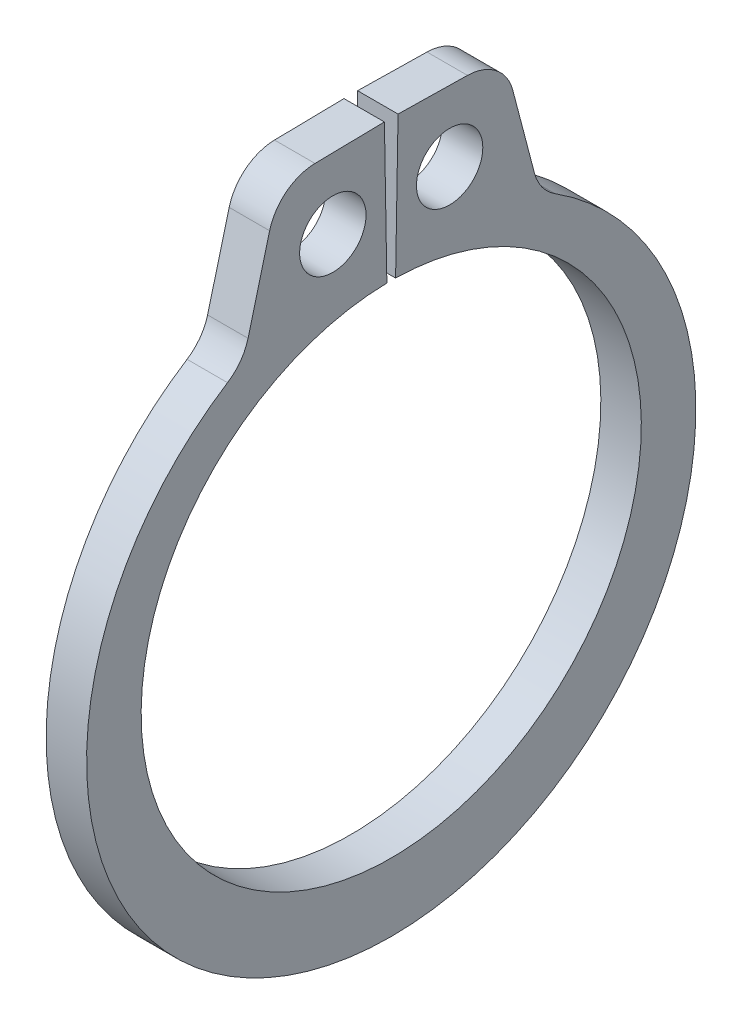
ISO-10303-21;
HEADER;
FILE_DESCRIPTION(('STEP AP214'),'2;1');
FILE_NAME('part.step','',(''),(''),'','','');
FILE_SCHEMA(('AUTOMOTIVE_DESIGN { 1 0 10303 214 1 1 1 1 }'));
ENDSEC;
DATA;
#1=APPLICATION_CONTEXT('core data for automotive mechanical design processes');
#2=APPLICATION_PROTOCOL_DEFINITION('international standard','automotive_design',2000,#1);
#3=PRODUCT_CONTEXT('',#1,'mechanical');
#4=PRODUCT('Part','Part','',(#3));
#5=PRODUCT_RELATED_PRODUCT_CATEGORY('part','',(#4));
#6=PRODUCT_DEFINITION_FORMATION('','',#4);
#7=PRODUCT_DEFINITION_CONTEXT('part definition',#1,'design');
#8=PRODUCT_DEFINITION('design','',#6,#7);
#9=PRODUCT_DEFINITION_SHAPE('','',#8);
#10=(LENGTH_UNIT() NAMED_UNIT(*) SI_UNIT(.MILLI.,.METRE.));
#11=(NAMED_UNIT(*) PLANE_ANGLE_UNIT() SI_UNIT($,.RADIAN.));
#12=(NAMED_UNIT(*) SI_UNIT($,.STERADIAN.) SOLID_ANGLE_UNIT());
#13=UNCERTAINTY_MEASURE_WITH_UNIT(LENGTH_MEASURE(1.E-05),#10,'distance_accuracy_value','');
#14=(GEOMETRIC_REPRESENTATION_CONTEXT(3) GLOBAL_UNCERTAINTY_ASSIGNED_CONTEXT((#13)) GLOBAL_UNIT_ASSIGNED_CONTEXT((#10,
#11,#12)) REPRESENTATION_CONTEXT('',''));
#15=CARTESIAN_POINT('',(0.,0.,0.));
#16=DIRECTION('',(0.,0.,1.));
#17=DIRECTION('',(1.,0.,0.));
#18=AXIS2_PLACEMENT_3D('',#15,#16,#17);
#19=CARTESIAN_POINT('',(0.3175,0.,0.));
#20=DIRECTION('',(1.,0.,0.));
#21=DIRECTION('',(0.,0.,-1.));
#22=AXIS2_PLACEMENT_3D('',#19,#20,#21);
#23=PLANE('',#22);
#24=CARTESIAN_POINT('',(0.3175,5.0139716555761,0.916320431238108));
#25=DIRECTION('',(1.,0.,0.));
#26=DIRECTION('',(0.,0.,-1.));
#27=AXIS2_PLACEMENT_3D('',#24,#25,#26);
#28=CIRCLE('',#27,0.5207);
#29=CARTESIAN_POINT('',(0.3175,5.0139716555761,0.395620431238108));
#30=VERTEX_POINT('',#29);
#31=EDGE_CURVE('E223',#30,#30,#28,.T.);
#32=ORIENTED_EDGE('',*,*,#31,.F.);
#33=EDGE_LOOP('',(#32));
#34=FACE_BOUND('',#33,.T.);
#35=DIRECTION('',(0.,-0.0174524064372914,0.999847695156391));
#36=VECTOR('',#35,1.);
#37=CARTESIAN_POINT('',(0.3175,6.13316574685882,0.107054806326941));
#38=LINE('',#37,#36);
#39=CARTESIAN_POINT('',(0.3175,6.13316574685882,0.107054806326941));
#40=VERTEX_POINT('',#39);
#41=CARTESIAN_POINT('',(0.3175,6.11415221793781,1.19633914867626));
#42=VERTEX_POINT('',#41);
#43=EDGE_CURVE('E135',#40,#42,#38,.T.);
#44=ORIENTED_EDGE('',*,*,#43,.T.);
#45=CARTESIAN_POINT('',(0.3175,5.36496633995713,1.1832620605328));
#46=DIRECTION('',(1.,0.,0.));
#47=DIRECTION('',(0.,0.,-1.));
#48=AXIS2_PLACEMENT_3D('',#45,#46,#47);
#49=CIRCLE('',#48,0.7493);
#50=CARTESIAN_POINT('',(0.3175,5.5548859477333,1.90809378761306));
#51=VERTEX_POINT('',#50);
#52=EDGE_CURVE('E176',#42,#51,#49,.T.);
#53=ORIENTED_EDGE('',*,*,#52,.T.);
#54=DIRECTION('',(0.,-0.967345158254712,0.253462708896528));
#55=VECTOR('',#54,1.);
#56=CARTESIAN_POINT('',(0.3175,6.10424100104998,1.76415238389439));
#57=LINE('',#56,#55);
#58=CARTESIAN_POINT('',(0.3175,4.26282323016591,2.24663863240217));
#59=VERTEX_POINT('',#58);
#60=EDGE_CURVE('E215',#51,#59,#57,.T.);
#61=ORIENTED_EDGE('',*,*,#60,.T.);
#62=CARTESIAN_POINT('',(0.3175,4.45274283794208,2.97147035948242));
#63=DIRECTION('',(1.,0.,0.));
#64=DIRECTION('',(0.,0.,-1.));
#65=AXIS2_PLACEMENT_3D('',#62,#63,#64);
#66=CIRCLE('',#65,0.7493);
#67=CARTESIAN_POINT('',(0.3175,3.82082167659982,2.56882146050486));
#68=VERTEX_POINT('',#67);
#69=EDGE_CURVE('E183',#59,#68,#66,.F.);
#70=ORIENTED_EDGE('',*,*,#69,.T.);
#71=CARTESIAN_POINT('',(0.3175,-0.210712110590818,0.));
#72=DIRECTION('',(1.,0.,0.));
#73=DIRECTION('',(0.,0.,-1.));
#74=AXIS2_PLACEMENT_3D('',#71,#72,#73);
#75=CIRCLE('',#74,4.78038788940918);
#76=CARTESIAN_POINT('',(0.3175,3.82082167659982,-2.56882146050486));
#77=VERTEX_POINT('',#76);
#78=EDGE_CURVE('E208',#68,#77,#75,.T.);
#79=ORIENTED_EDGE('',*,*,#78,.T.);
#80=CARTESIAN_POINT('',(0.3175,4.45274283794208,-2.97147035948242));
#81=DIRECTION('',(1.,0.,0.));
#82=DIRECTION('',(0.,0.,-1.));
#83=AXIS2_PLACEMENT_3D('',#80,#81,#82);
#84=CIRCLE('',#83,0.7493);
#85=CARTESIAN_POINT('',(0.3175,4.26282323016591,-2.24663863240217));
#86=VERTEX_POINT('',#85);
#87=EDGE_CURVE('E11',#77,#86,#84,.F.);
#88=ORIENTED_EDGE('',*,*,#87,.T.);
#89=DIRECTION('',(0.,0.967345158254712,0.253462708896528));
#90=VECTOR('',#89,1.);
#91=CARTESIAN_POINT('',(0.3175,6.10424100104998,-1.76415238389439));
#92=LINE('',#91,#90);
#93=CARTESIAN_POINT('',(0.3175,5.5548859477333,-1.90809378761306));
#94=VERTEX_POINT('',#93);
#95=EDGE_CURVE('E207',#86,#94,#92,.T.);
#96=ORIENTED_EDGE('',*,*,#95,.T.);
#97=CARTESIAN_POINT('',(0.3175,5.36496633995713,-1.1832620605328));
#98=DIRECTION('',(1.,0.,0.));
#99=DIRECTION('',(0.,0.,-1.));
#100=AXIS2_PLACEMENT_3D('',#97,#98,#99);
#101=CIRCLE('',#100,0.7493);
#102=CARTESIAN_POINT('',(0.3175,6.11415221793781,-1.19633914867626));
#103=VERTEX_POINT('',#102);
#104=EDGE_CURVE('E51',#94,#103,#101,.T.);
#105=ORIENTED_EDGE('',*,*,#104,.T.);
#106=DIRECTION('',(0.,0.0174524064372914,0.999847695156391));
#107=VECTOR('',#106,1.);
#108=CARTESIAN_POINT('',(0.3175,6.13316574685882,-0.107054806326941));
#109=LINE('',#108,#107);
#110=CARTESIAN_POINT('',(0.3175,6.13316574685882,-0.107054806326941));
#111=VERTEX_POINT('',#110);
#112=EDGE_CURVE('E212',#103,#111,#109,.T.);
#113=ORIENTED_EDGE('',*,*,#112,.T.);
#114=DIRECTION('',(0.,-0.999847695156391,0.0174524064372835));
#115=VECTOR('',#114,1.);
#116=CARTESIAN_POINT('',(0.3175,3.92370231010222,-0.0684884785818319));
#117=LINE('',#116,#115);
#118=CARTESIAN_POINT('',(0.3175,3.92370231010222,-0.0684884785818319));
#119=VERTEX_POINT('',#118);
#120=EDGE_CURVE('E141',#111,#119,#117,.T.);
#121=ORIENTED_EDGE('',*,*,#120,.T.);
#122=CARTESIAN_POINT('',(0.3175,0.,0.));
#123=DIRECTION('',(-1.,0.,0.));
#124=DIRECTION('',(0.,0.,-1.));
#125=AXIS2_PLACEMENT_3D('',#122,#123,#124);
#126=CIRCLE('',#125,3.9243);
#127=CARTESIAN_POINT('',(0.3175,3.92370231010222,0.0684884785818319));
#128=VERTEX_POINT('',#127);
#129=EDGE_CURVE('E136',#119,#128,#126,.T.);
#130=ORIENTED_EDGE('',*,*,#129,.T.);
#131=DIRECTION('',(0.,0.999847695156391,0.0174524064372835));
#132=VECTOR('',#131,1.);
#133=CARTESIAN_POINT('',(0.3175,3.92370231010222,0.0684884785818319));
#134=LINE('',#133,#132);
#135=EDGE_CURVE('E127',#128,#40,#134,.T.);
#136=ORIENTED_EDGE('',*,*,#135,.T.);
#137=EDGE_LOOP('',(#44,#53,#61,#70,#79,#88,#96,#105,#113,#121,#130,#136));
#138=FACE_BOUND('',#137,.T.);
#139=CARTESIAN_POINT('',(0.3175,5.0139716555761,-0.916320431238108));
#140=DIRECTION('',(1.,0.,0.));
#141=DIRECTION('',(0.,0.,-1.));
#142=AXIS2_PLACEMENT_3D('',#139,#140,#141);
#143=CIRCLE('',#142,0.5207);
#144=CARTESIAN_POINT('',(0.3175,5.0139716555761,-1.43702043123811));
#145=VERTEX_POINT('',#144);
#146=EDGE_CURVE('E249',#145,#145,#143,.T.);
#147=ORIENTED_EDGE('',*,*,#146,.F.);
#148=EDGE_LOOP('',(#147));
#149=FACE_BOUND('',#148,.T.);
#150=ADVANCED_FACE('F36',(#34,#138,#149),#23,.T.);
#151=CARTESIAN_POINT('',(-0.3175,0.,0.));
#152=DIRECTION('',(1.,0.,0.));
#153=DIRECTION('',(0.,0.,-1.));
#154=AXIS2_PLACEMENT_3D('',#151,#152,#153);
#155=PLANE('',#154);
#156=CARTESIAN_POINT('',(-0.3175,5.0139716555761,0.916320431238108));
#157=DIRECTION('',(1.,0.,0.));
#158=DIRECTION('',(0.,0.,-1.));
#159=AXIS2_PLACEMENT_3D('',#156,#157,#158);
#160=CIRCLE('',#159,0.5207);
#161=CARTESIAN_POINT('',(-0.3175,5.0139716555761,0.395620431238108));
#162=VERTEX_POINT('',#161);
#163=EDGE_CURVE('E246',#162,#162,#160,.T.);
#164=ORIENTED_EDGE('',*,*,#163,.T.);
#165=EDGE_LOOP('',(#164));
#166=FACE_BOUND('',#165,.T.);
#167=DIRECTION('',(0.,-0.967345158254712,0.253462708896528));
#168=VECTOR('',#167,1.);
#169=CARTESIAN_POINT('',(-0.3175,6.10424100104998,1.76415238389439));
#170=LINE('',#169,#168);
#171=CARTESIAN_POINT('',(-0.3175,5.5548859477333,1.90809378761306));
#172=VERTEX_POINT('',#171);
#173=CARTESIAN_POINT('',(-0.3175,4.26282323016591,2.24663863240217));
#174=VERTEX_POINT('',#173);
#175=EDGE_CURVE('E202',#172,#174,#170,.T.);
#176=ORIENTED_EDGE('',*,*,#175,.F.);
#177=CARTESIAN_POINT('',(-0.3175,5.36496633995713,1.1832620605328));
#178=DIRECTION('',(1.,0.,0.));
#179=DIRECTION('',(0.,0.,-1.));
#180=AXIS2_PLACEMENT_3D('',#177,#178,#179);
#181=CIRCLE('',#180,0.7493);
#182=CARTESIAN_POINT('',(-0.3175,6.11415221793781,1.19633914867626));
#183=VERTEX_POINT('',#182);
#184=EDGE_CURVE('E172',#172,#183,#181,.F.);
#185=ORIENTED_EDGE('',*,*,#184,.T.);
#186=DIRECTION('',(0.,-0.0174524064372914,0.999847695156391));
#187=VECTOR('',#186,1.);
#188=CARTESIAN_POINT('',(-0.3175,6.13316574685882,0.107054806326941));
#189=LINE('',#188,#187);
#190=CARTESIAN_POINT('',(-0.3175,6.13316574685882,0.107054806326941));
#191=VERTEX_POINT('',#190);
#192=EDGE_CURVE('E225',#191,#183,#189,.T.);
#193=ORIENTED_EDGE('',*,*,#192,.F.);
#194=DIRECTION('',(0.,0.999847695156391,0.0174524064372835));
#195=VECTOR('',#194,1.);
#196=CARTESIAN_POINT('',(-0.3175,3.92370231010222,0.0684884785818319));
#197=LINE('',#196,#195);
#198=CARTESIAN_POINT('',(-0.3175,3.92370231010222,0.0684884785818319));
#199=VERTEX_POINT('',#198);
#200=EDGE_CURVE('E222',#199,#191,#197,.T.);
#201=ORIENTED_EDGE('',*,*,#200,.F.);
#202=CARTESIAN_POINT('',(-0.3175,0.,0.));
#203=DIRECTION('',(-1.,0.,0.));
#204=DIRECTION('',(0.,0.,-1.));
#205=AXIS2_PLACEMENT_3D('',#202,#203,#204);
#206=CIRCLE('',#205,3.9243);
#207=CARTESIAN_POINT('',(-0.3175,3.92370231010222,-0.0684884785818319));
#208=VERTEX_POINT('',#207);
#209=EDGE_CURVE('E149',#208,#199,#206,.T.);
#210=ORIENTED_EDGE('',*,*,#209,.F.);
#211=DIRECTION('',(0.,-0.999847695156391,0.0174524064372835));
#212=VECTOR('',#211,1.);
#213=CARTESIAN_POINT('',(-0.3175,3.92370231010222,-0.0684884785818319));
#214=LINE('',#213,#212);
#215=CARTESIAN_POINT('',(-0.3175,6.13316574685882,-0.107054806326941));
#216=VERTEX_POINT('',#215);
#217=EDGE_CURVE('E145',#216,#208,#214,.T.);
#218=ORIENTED_EDGE('',*,*,#217,.F.);
#219=DIRECTION('',(0.,0.0174524064372914,0.999847695156391));
#220=VECTOR('',#219,1.);
#221=CARTESIAN_POINT('',(-0.3175,6.13316574685882,-0.107054806326941));
#222=LINE('',#221,#220);
#223=CARTESIAN_POINT('',(-0.3175,6.11415221793781,-1.19633914867626));
#224=VERTEX_POINT('',#223);
#225=EDGE_CURVE('E230',#224,#216,#222,.T.);
#226=ORIENTED_EDGE('',*,*,#225,.F.);
#227=CARTESIAN_POINT('',(-0.3175,5.36496633995713,-1.1832620605328));
#228=DIRECTION('',(1.,0.,0.));
#229=DIRECTION('',(0.,0.,-1.));
#230=AXIS2_PLACEMENT_3D('',#227,#228,#229);
#231=CIRCLE('',#230,0.7493);
#232=CARTESIAN_POINT('',(-0.3175,5.5548859477333,-1.90809378761306));
#233=VERTEX_POINT('',#232);
#234=EDGE_CURVE('E170',#224,#233,#231,.F.);
#235=ORIENTED_EDGE('',*,*,#234,.T.);
#236=DIRECTION('',(0.,0.967345158254712,0.253462708896528));
#237=VECTOR('',#236,1.);
#238=CARTESIAN_POINT('',(-0.3175,6.10424100104998,-1.76415238389439));
#239=LINE('',#238,#237);
#240=CARTESIAN_POINT('',(-0.3175,4.26282323016591,-2.24663863240217));
#241=VERTEX_POINT('',#240);
#242=EDGE_CURVE('E193',#241,#233,#239,.T.);
#243=ORIENTED_EDGE('',*,*,#242,.F.);
#244=CARTESIAN_POINT('',(-0.3175,4.45274283794208,-2.97147035948242));
#245=DIRECTION('',(1.,0.,0.));
#246=DIRECTION('',(0.,0.,-1.));
#247=AXIS2_PLACEMENT_3D('',#244,#245,#246);
#248=CIRCLE('',#247,0.7493);
#249=CARTESIAN_POINT('',(-0.3175,3.82082167659982,-2.56882146050486));
#250=VERTEX_POINT('',#249);
#251=EDGE_CURVE('E44',#241,#250,#248,.T.);
#252=ORIENTED_EDGE('',*,*,#251,.T.);
#253=CARTESIAN_POINT('',(-0.3175,-0.210712110590818,0.));
#254=DIRECTION('',(1.,0.,0.));
#255=DIRECTION('',(0.,0.,-1.));
#256=AXIS2_PLACEMENT_3D('',#253,#254,#255);
#257=CIRCLE('',#256,4.78038788940918);
#258=CARTESIAN_POINT('',(-0.3175,3.82082167659982,2.56882146050486));
#259=VERTEX_POINT('',#258);
#260=EDGE_CURVE('E191',#259,#250,#257,.T.);
#261=ORIENTED_EDGE('',*,*,#260,.F.);
#262=CARTESIAN_POINT('',(-0.3175,4.45274283794208,2.97147035948242));
#263=DIRECTION('',(1.,0.,0.));
#264=DIRECTION('',(0.,0.,-1.));
#265=AXIS2_PLACEMENT_3D('',#262,#263,#264);
#266=CIRCLE('',#265,0.7493);
#267=EDGE_CURVE('E181',#259,#174,#266,.T.);
#268=ORIENTED_EDGE('',*,*,#267,.T.);
#269=EDGE_LOOP('',(#176,#185,#193,#201,#210,#218,#226,#235,#243,#252,#261,#268));
#270=FACE_BOUND('',#269,.T.);
#271=CARTESIAN_POINT('',(-0.3175,5.0139716555761,-0.916320431238108));
#272=DIRECTION('',(1.,0.,0.));
#273=DIRECTION('',(0.,0.,-1.));
#274=AXIS2_PLACEMENT_3D('',#271,#272,#273);
#275=CIRCLE('',#274,0.5207);
#276=CARTESIAN_POINT('',(-0.3175,5.0139716555761,-1.43702043123811));
#277=VERTEX_POINT('',#276);
#278=EDGE_CURVE('E252',#277,#277,#275,.T.);
#279=ORIENTED_EDGE('',*,*,#278,.T.);
#280=EDGE_LOOP('',(#279));
#281=FACE_BOUND('',#280,.T.);
#282=ADVANCED_FACE('F189',(#166,#270,#281),#155,.F.);
#283=CARTESIAN_POINT('',(0.3175,0.,0.));
#284=DIRECTION('',(-1.,0.,0.));
#285=DIRECTION('',(0.,0.,1.));
#286=AXIS2_PLACEMENT_3D('',#283,#284,#285);
#287=CYLINDRICAL_SURFACE('',#286,3.9243);
#288=ORIENTED_EDGE('',*,*,#209,.T.);
#289=DIRECTION('',(-1.,0.,0.));
#290=VECTOR('',#289,1.);
#291=CARTESIAN_POINT('',(0.3175,3.92370231010222,0.0684884785818319));
#292=LINE('',#291,#290);
#293=EDGE_CURVE('E131',#128,#199,#292,.T.);
#294=ORIENTED_EDGE('',*,*,#293,.F.);
#295=ORIENTED_EDGE('',*,*,#129,.F.);
#296=DIRECTION('',(-1.,0.,0.));
#297=VECTOR('',#296,1.);
#298=CARTESIAN_POINT('',(0.3175,3.92370231010222,-0.0684884785818319));
#299=LINE('',#298,#297);
#300=EDGE_CURVE('E220',#119,#208,#299,.T.);
#301=ORIENTED_EDGE('',*,*,#300,.T.);
#302=EDGE_LOOP('',(#288,#294,#295,#301));
#303=FACE_BOUND('',#302,.T.);
#304=ADVANCED_FACE('F147',(#303),#287,.F.);
#305=CARTESIAN_POINT('',(0.3175,3.92370231010222,0.0684884785818319));
#306=DIRECTION('',(0.,-0.0174524064372835,0.999847695156391));
#307=DIRECTION('',(0.,-0.999847695156391,-0.0174524064372835));
#308=AXIS2_PLACEMENT_3D('',#305,#306,#307);
#309=PLANE('',#308);
#310=ORIENTED_EDGE('',*,*,#200,.T.);
#311=DIRECTION('',(-1.,0.,0.));
#312=VECTOR('',#311,1.);
#313=CARTESIAN_POINT('',(0.3175,6.13316574685882,0.107054806326941));
#314=LINE('',#313,#312);
#315=EDGE_CURVE('E134',#40,#191,#314,.T.);
#316=ORIENTED_EDGE('',*,*,#315,.F.);
#317=ORIENTED_EDGE('',*,*,#135,.F.);
#318=ORIENTED_EDGE('',*,*,#293,.T.);
#319=EDGE_LOOP('',(#310,#316,#317,#318));
#320=FACE_BOUND('',#319,.T.);
#321=ADVANCED_FACE('F129',(#320),#309,.F.);
#322=CARTESIAN_POINT('',(0.3175,6.13316574685882,0.107054806326941));
#323=DIRECTION('',(0.,-0.999847695156391,-0.0174524064372914));
#324=DIRECTION('',(0.,0.0174524064372914,-0.999847695156391));
#325=AXIS2_PLACEMENT_3D('',#322,#323,#324);
#326=PLANE('',#325);
#327=ORIENTED_EDGE('',*,*,#192,.T.);
#328=DIRECTION('',(-1.,0.,0.));
#329=VECTOR('',#328,1.);
#330=CARTESIAN_POINT('',(0.3175,6.11415221793781,1.19633914867626));
#331=LINE('',#330,#329);
#332=EDGE_CURVE('E59',#183,#42,#331,.F.);
#333=ORIENTED_EDGE('',*,*,#332,.T.);
#334=ORIENTED_EDGE('',*,*,#43,.F.);
#335=ORIENTED_EDGE('',*,*,#315,.T.);
#336=EDGE_LOOP('',(#327,#333,#334,#335));
#337=FACE_BOUND('',#336,.T.);
#338=ADVANCED_FACE('F241',(#337),#326,.F.);
#339=CARTESIAN_POINT('',(0.3175,6.10424100104998,1.76415238389439));
#340=DIRECTION('',(0.,-0.253462708896528,-0.967345158254712));
#341=DIRECTION('',(0.,0.967345158254712,-0.253462708896528));
#342=AXIS2_PLACEMENT_3D('',#339,#340,#341);
#343=PLANE('',#342);
#344=ORIENTED_EDGE('',*,*,#175,.T.);
#345=DIRECTION('',(1.,0.,0.));
#346=VECTOR('',#345,1.);
#347=CARTESIAN_POINT('',(0.3175,4.26282323016591,2.24663863240217));
#348=LINE('',#347,#346);
#349=EDGE_CURVE('E163',#174,#59,#348,.T.);
#350=ORIENTED_EDGE('',*,*,#349,.T.);
#351=ORIENTED_EDGE('',*,*,#60,.F.);
#352=DIRECTION('',(-1.,0.,0.));
#353=VECTOR('',#352,1.);
#354=CARTESIAN_POINT('',(0.3175,5.5548859477333,1.90809378761306));
#355=LINE('',#354,#353);
#356=EDGE_CURVE('E160',#51,#172,#355,.T.);
#357=ORIENTED_EDGE('',*,*,#356,.T.);
#358=EDGE_LOOP('',(#344,#350,#351,#357));
#359=FACE_BOUND('',#358,.T.);
#360=ADVANCED_FACE('F282',(#359),#343,.F.);
#361=CARTESIAN_POINT('',(0.3175,-0.210712110590818,0.));
#362=DIRECTION('',(-1.,0.,0.));
#363=DIRECTION('',(0.,0.,1.));
#364=AXIS2_PLACEMENT_3D('',#361,#362,#363);
#365=CYLINDRICAL_SURFACE('',#364,4.78038788940918);
#366=ORIENTED_EDGE('',*,*,#78,.F.);
#367=DIRECTION('',(-1.,0.,0.));
#368=VECTOR('',#367,1.);
#369=CARTESIAN_POINT('',(0.3175,3.82082167659982,2.56882146050486));
#370=LINE('',#369,#368);
#371=EDGE_CURVE('E152',#68,#259,#370,.T.);
#372=ORIENTED_EDGE('',*,*,#371,.T.);
#373=ORIENTED_EDGE('',*,*,#260,.T.);
#374=DIRECTION('',(-1.,0.,0.));
#375=VECTOR('',#374,1.);
#376=CARTESIAN_POINT('',(0.3175,3.82082167659982,-2.56882146050486));
#377=LINE('',#376,#375);
#378=EDGE_CURVE('E150',#250,#77,#377,.F.);
#379=ORIENTED_EDGE('',*,*,#378,.T.);
#380=EDGE_LOOP('',(#366,#372,#373,#379));
#381=FACE_BOUND('',#380,.T.);
#382=ADVANCED_FACE('F199',(#381),#365,.T.);
#383=CARTESIAN_POINT('',(0.3175,6.10424100104998,-1.76415238389439));
#384=DIRECTION('',(0.,-0.253462708896528,0.967345158254712));
#385=DIRECTION('',(0.,-0.967345158254712,-0.253462708896528));
#386=AXIS2_PLACEMENT_3D('',#383,#384,#385);
#387=PLANE('',#386);
#388=ORIENTED_EDGE('',*,*,#95,.F.);
#389=DIRECTION('',(1.,0.,0.));
#390=VECTOR('',#389,1.);
#391=CARTESIAN_POINT('',(-0.3175,4.26282323016591,-2.24663863240217));
#392=LINE('',#391,#390);
#393=EDGE_CURVE('E167',#86,#241,#392,.F.);
#394=ORIENTED_EDGE('',*,*,#393,.T.);
#395=ORIENTED_EDGE('',*,*,#242,.T.);
#396=DIRECTION('',(-1.,0.,0.));
#397=VECTOR('',#396,1.);
#398=CARTESIAN_POINT('',(0.3175,5.5548859477333,-1.90809378761306));
#399=LINE('',#398,#397);
#400=EDGE_CURVE('E165',#233,#94,#399,.F.);
#401=ORIENTED_EDGE('',*,*,#400,.T.);
#402=EDGE_LOOP('',(#388,#394,#395,#401));
#403=FACE_BOUND('',#402,.T.);
#404=ADVANCED_FACE('F210',(#403),#387,.F.);
#405=CARTESIAN_POINT('',(0.3175,6.13316574685882,-0.107054806326941));
#406=DIRECTION('',(0.,-0.999847695156391,0.0174524064372914));
#407=DIRECTION('',(0.,-0.0174524064372914,-0.999847695156391));
#408=AXIS2_PLACEMENT_3D('',#405,#406,#407);
#409=PLANE('',#408);
#410=ORIENTED_EDGE('',*,*,#112,.F.);
#411=DIRECTION('',(-1.,0.,0.));
#412=VECTOR('',#411,1.);
#413=CARTESIAN_POINT('',(0.3175,6.11415221793781,-1.19633914867626));
#414=LINE('',#413,#412);
#415=EDGE_CURVE('E178',#103,#224,#414,.T.);
#416=ORIENTED_EDGE('',*,*,#415,.T.);
#417=ORIENTED_EDGE('',*,*,#225,.T.);
#418=DIRECTION('',(-1.,0.,0.));
#419=VECTOR('',#418,1.);
#420=CARTESIAN_POINT('',(0.3175,6.13316574685882,-0.107054806326941));
#421=LINE('',#420,#419);
#422=EDGE_CURVE('E154',#111,#216,#421,.T.);
#423=ORIENTED_EDGE('',*,*,#422,.F.);
#424=EDGE_LOOP('',(#410,#416,#417,#423));
#425=FACE_BOUND('',#424,.T.);
#426=ADVANCED_FACE('F275',(#425),#409,.F.);
#427=CARTESIAN_POINT('',(0.3175,3.92370231010222,-0.0684884785818319));
#428=DIRECTION('',(0.,-0.0174524064372835,-0.999847695156391));
#429=DIRECTION('',(0.,0.999847695156391,-0.0174524064372835));
#430=AXIS2_PLACEMENT_3D('',#427,#428,#429);
#431=PLANE('',#430);
#432=ORIENTED_EDGE('',*,*,#217,.T.);
#433=ORIENTED_EDGE('',*,*,#300,.F.);
#434=ORIENTED_EDGE('',*,*,#120,.F.);
#435=ORIENTED_EDGE('',*,*,#422,.T.);
#436=EDGE_LOOP('',(#432,#433,#434,#435));
#437=FACE_BOUND('',#436,.T.);
#438=ADVANCED_FACE('F237',(#437),#431,.F.);
#439=CARTESIAN_POINT('',(0.3175,5.0139716555761,0.916320431238108));
#440=DIRECTION('',(-1.,0.,0.));
#441=DIRECTION('',(0.,0.,1.));
#442=AXIS2_PLACEMENT_3D('',#439,#440,#441);
#443=CYLINDRICAL_SURFACE('',#442,0.5207);
#444=ORIENTED_EDGE('',*,*,#31,.T.);
#445=EDGE_LOOP('',(#444));
#446=FACE_BOUND('',#445,.T.);
#447=ORIENTED_EDGE('',*,*,#163,.F.);
#448=EDGE_LOOP('',(#447));
#449=FACE_BOUND('',#448,.T.);
#450=ADVANCED_FACE('F270',(#446,#449),#443,.F.);
#451=CARTESIAN_POINT('',(0.3175,5.0139716555761,-0.916320431238108));
#452=DIRECTION('',(-1.,0.,0.));
#453=DIRECTION('',(0.,0.,1.));
#454=AXIS2_PLACEMENT_3D('',#451,#452,#453);
#455=CYLINDRICAL_SURFACE('',#454,0.5207);
#456=ORIENTED_EDGE('',*,*,#146,.T.);
#457=EDGE_LOOP('',(#456));
#458=FACE_BOUND('',#457,.T.);
#459=ORIENTED_EDGE('',*,*,#278,.F.);
#460=EDGE_LOOP('',(#459));
#461=FACE_BOUND('',#460,.T.);
#462=ADVANCED_FACE('F258',(#458,#461),#455,.F.);
#463=CARTESIAN_POINT('',(0.3175,4.45274283794208,2.97147035948242));
#464=DIRECTION('',(-1.,0.,0.));
#465=DIRECTION('',(0.,0.,1.));
#466=AXIS2_PLACEMENT_3D('',#463,#464,#465);
#467=CYLINDRICAL_SURFACE('',#466,0.7493);
#468=ORIENTED_EDGE('',*,*,#69,.F.);
#469=ORIENTED_EDGE('',*,*,#349,.F.);
#470=ORIENTED_EDGE('',*,*,#267,.F.);
#471=ORIENTED_EDGE('',*,*,#371,.F.);
#472=EDGE_LOOP('',(#468,#469,#470,#471));
#473=FACE_BOUND('',#472,.T.);
#474=ADVANCED_FACE('F292',(#473),#467,.F.);
#475=CARTESIAN_POINT('',(0.3175,4.45274283794208,-2.97147035948242));
#476=DIRECTION('',(-1.,0.,0.));
#477=DIRECTION('',(0.,0.,1.));
#478=AXIS2_PLACEMENT_3D('',#475,#476,#477);
#479=CYLINDRICAL_SURFACE('',#478,0.7493);
#480=ORIENTED_EDGE('',*,*,#87,.F.);
#481=ORIENTED_EDGE('',*,*,#378,.F.);
#482=ORIENTED_EDGE('',*,*,#251,.F.);
#483=ORIENTED_EDGE('',*,*,#393,.F.);
#484=EDGE_LOOP('',(#480,#481,#482,#483));
#485=FACE_BOUND('',#484,.T.);
#486=ADVANCED_FACE('F205',(#485),#479,.F.);
#487=CARTESIAN_POINT('',(0.3175,5.36496633995713,1.1832620605328));
#488=DIRECTION('',(-1.,0.,0.));
#489=DIRECTION('',(0.,0.,1.));
#490=AXIS2_PLACEMENT_3D('',#487,#488,#489);
#491=CYLINDRICAL_SURFACE('',#490,0.7493);
#492=ORIENTED_EDGE('',*,*,#52,.F.);
#493=ORIENTED_EDGE('',*,*,#332,.F.);
#494=ORIENTED_EDGE('',*,*,#184,.F.);
#495=ORIENTED_EDGE('',*,*,#356,.F.);
#496=EDGE_LOOP('',(#492,#493,#494,#495));
#497=FACE_BOUND('',#496,.T.);
#498=ADVANCED_FACE('F297',(#497),#491,.T.);
#499=CARTESIAN_POINT('',(0.3175,5.36496633995713,-1.1832620605328));
#500=DIRECTION('',(-1.,0.,0.));
#501=DIRECTION('',(0.,0.,1.));
#502=AXIS2_PLACEMENT_3D('',#499,#500,#501);
#503=CYLINDRICAL_SURFACE('',#502,0.7493);
#504=ORIENTED_EDGE('',*,*,#104,.F.);
#505=ORIENTED_EDGE('',*,*,#400,.F.);
#506=ORIENTED_EDGE('',*,*,#234,.F.);
#507=ORIENTED_EDGE('',*,*,#415,.F.);
#508=EDGE_LOOP('',(#504,#505,#506,#507));
#509=FACE_BOUND('',#508,.T.);
#510=ADVANCED_FACE('F38',(#509),#503,.T.);
#511=CLOSED_SHELL('',(#150,#282,#304,#321,#338,#360,#382,#404,#426,#438,#450,#462,#474,#486,
#498,#510));
#512=MANIFOLD_SOLID_BREP('B2',#511);
#513=ADVANCED_BREP_SHAPE_REPRESENTATION('',(#18,#512),#14);
#514=SHAPE_DEFINITION_REPRESENTATION(#9,#513);
ENDSEC;
END-ISO-10303-21;
